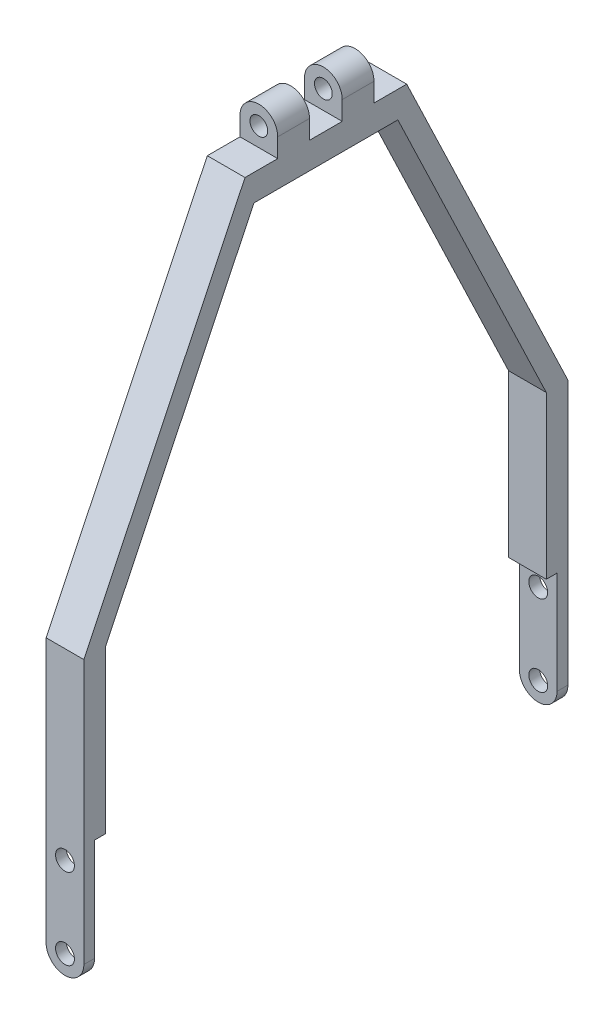
ISO-10303-21;
HEADER;
FILE_DESCRIPTION(('STEP AP214'),'2;1');
FILE_NAME('part.step','',(''),(''),'','','');
FILE_SCHEMA(('AUTOMOTIVE_DESIGN { 1 0 10303 214 1 1 1 1 }'));
ENDSEC;
DATA;
#1=APPLICATION_CONTEXT('core data for automotive mechanical design processes');
#2=APPLICATION_PROTOCOL_DEFINITION('international standard','automotive_design',2000,#1);
#3=PRODUCT_CONTEXT('',#1,'mechanical');
#4=PRODUCT('Part','Part','',(#3));
#5=PRODUCT_RELATED_PRODUCT_CATEGORY('part','',(#4));
#6=PRODUCT_DEFINITION_FORMATION('','',#4);
#7=PRODUCT_DEFINITION_CONTEXT('part definition',#1,'design');
#8=PRODUCT_DEFINITION('design','',#6,#7);
#9=PRODUCT_DEFINITION_SHAPE('','',#8);
#10=(LENGTH_UNIT() NAMED_UNIT(*) SI_UNIT(.MILLI.,.METRE.));
#11=(NAMED_UNIT(*) PLANE_ANGLE_UNIT() SI_UNIT($,.RADIAN.));
#12=(NAMED_UNIT(*) SI_UNIT($,.STERADIAN.) SOLID_ANGLE_UNIT());
#13=UNCERTAINTY_MEASURE_WITH_UNIT(LENGTH_MEASURE(1.E-05),#10,'distance_accuracy_value','');
#14=(GEOMETRIC_REPRESENTATION_CONTEXT(3) GLOBAL_UNCERTAINTY_ASSIGNED_CONTEXT((#13)) GLOBAL_UNIT_ASSIGNED_CONTEXT((#10,
#11,#12)) REPRESENTATION_CONTEXT('',''));
#15=CARTESIAN_POINT('',(0.,0.,0.));
#16=DIRECTION('',(0.,0.,1.));
#17=DIRECTION('',(1.,0.,0.));
#18=AXIS2_PLACEMENT_3D('',#15,#16,#17);
#19=CARTESIAN_POINT('',(0.,100.,-89.8));
#20=DIRECTION('',(0.,0.,1.));
#21=DIRECTION('',(1.,0.,0.));
#22=AXIS2_PLACEMENT_3D('',#19,#20,#21);
#23=CYLINDRICAL_SURFACE('',#22,3.5);
#24=DIRECTION('',(0.,0.,1.));
#25=VECTOR('',#24,1.);
#26=CARTESIAN_POINT('',(3.49999999999999,100.,-89.8));
#27=LINE('',#26,#25);
#28=CARTESIAN_POINT('',(3.49999999999999,100.,-53.83));
#29=VERTEX_POINT('',#28);
#30=CARTESIAN_POINT('',(3.49999999999999,100.,-47.935));
#31=VERTEX_POINT('',#30);
#32=EDGE_CURVE('E12',#29,#31,#27,.T.);
#33=ORIENTED_EDGE('',*,*,#32,.F.);
#34=CARTESIAN_POINT('',(0.,100.,-53.83));
#35=DIRECTION('',(0.,0.,-1.));
#36=DIRECTION('',(-1.,0.,0.));
#37=AXIS2_PLACEMENT_3D('',#34,#35,#36);
#38=CIRCLE('',#37,3.5);
#39=CARTESIAN_POINT('',(-3.50000000000001,100.,-53.83));
#40=VERTEX_POINT('',#39);
#41=EDGE_CURVE('E445',#29,#40,#38,.F.);
#42=ORIENTED_EDGE('',*,*,#41,.T.);
#43=DIRECTION('',(0.,0.,1.));
#44=VECTOR('',#43,1.);
#45=CARTESIAN_POINT('',(-3.50000000000001,100.,-89.8));
#46=LINE('',#45,#44);
#47=CARTESIAN_POINT('',(-3.50000000000001,100.,-47.935));
#48=VERTEX_POINT('',#47);
#49=EDGE_CURVE('E492',#40,#48,#46,.T.);
#50=ORIENTED_EDGE('',*,*,#49,.T.);
#51=CARTESIAN_POINT('',(0.,100.,-47.935));
#52=DIRECTION('',(0.,0.,1.));
#53=DIRECTION('',(1.,0.,0.));
#54=AXIS2_PLACEMENT_3D('',#51,#52,#53);
#55=CIRCLE('',#54,3.5);
#56=EDGE_CURVE('E437',#48,#31,#55,.F.);
#57=ORIENTED_EDGE('',*,*,#56,.T.);
#58=EDGE_LOOP('',(#33,#42,#50,#57));
#59=FACE_BOUND('',#58,.T.);
#60=ADVANCED_FACE('F126',(#59),#23,.T.);
#61=CARTESIAN_POINT('',(0.,100.,-41.865));
#62=DIRECTION('',(0.,0.,1.));
#63=DIRECTION('',(1.,0.,0.));
#64=AXIS2_PLACEMENT_3D('',#61,#62,#63);
#65=CIRCLE('',#64,3.5);
#66=CARTESIAN_POINT('',(-3.50000000000001,100.,-41.865));
#67=VERTEX_POINT('',#66);
#68=CARTESIAN_POINT('',(3.49999999999999,100.,-41.865));
#69=VERTEX_POINT('',#68);
#70=EDGE_CURVE('E296',#67,#69,#65,.F.);
#71=ORIENTED_EDGE('',*,*,#70,.F.);
#72=CARTESIAN_POINT('',(-3.50000000000001,100.,-35.97));
#73=VERTEX_POINT('',#72);
#74=EDGE_CURVE('E480',#67,#73,#46,.T.);
#75=ORIENTED_EDGE('',*,*,#74,.T.);
#76=CARTESIAN_POINT('',(0.,100.,-35.97));
#77=DIRECTION('',(0.,0.,1.));
#78=DIRECTION('',(1.,0.,0.));
#79=AXIS2_PLACEMENT_3D('',#76,#77,#78);
#80=CIRCLE('',#79,3.5);
#81=CARTESIAN_POINT('',(3.49999999999999,100.,-35.97));
#82=VERTEX_POINT('',#81);
#83=EDGE_CURVE('E432',#73,#82,#80,.F.);
#84=ORIENTED_EDGE('',*,*,#83,.T.);
#85=EDGE_CURVE('E140',#69,#82,#27,.T.);
#86=ORIENTED_EDGE('',*,*,#85,.F.);
#87=EDGE_LOOP('',(#71,#75,#84,#86));
#88=FACE_BOUND('',#87,.T.);
#89=ADVANCED_FACE('F535',(#88),#23,.T.);
#90=CARTESIAN_POINT('',(3.49999999999999,-15.,-89.8));
#91=DIRECTION('',(1.,0.,0.));
#92=DIRECTION('',(0.,1.,0.));
#93=AXIS2_PLACEMENT_3D('',#90,#91,#92);
#94=PLANE('',#93);
#95=DIRECTION('',(0.,0.902085364461004,-0.431557638358144));
#96=VECTOR('',#95,1.);
#97=CARTESIAN_POINT('',(3.49999999999999,6.33222783765879,13.236262202464));
#98=LINE('',#97,#96);
#99=CARTESIAN_POINT('',(3.49999999999999,34.,0.));
#100=VERTEX_POINT('',#99);
#101=CARTESIAN_POINT('',(3.49999999999999,96.5,-29.9));
#102=VERTEX_POINT('',#101);
#103=EDGE_CURVE('E403',#100,#102,#98,.T.);
#104=ORIENTED_EDGE('',*,*,#103,.F.);
#105=DIRECTION('',(0.,1.,0.));
#106=VECTOR('',#105,1.);
#107=CARTESIAN_POINT('',(3.49999999999999,-15.,0.));
#108=LINE('',#107,#106);
#109=CARTESIAN_POINT('',(3.49999999999999,-15.,0.));
#110=VERTEX_POINT('',#109);
#111=EDGE_CURVE('E472',#110,#100,#108,.T.);
#112=ORIENTED_EDGE('',*,*,#111,.F.);
#113=DIRECTION('',(0.,0.,1.));
#114=VECTOR('',#113,1.);
#115=CARTESIAN_POINT('',(3.49999999999999,-15.,-89.8));
#116=LINE('',#115,#114);
#117=CARTESIAN_POINT('',(3.49999999999999,-15.,-2.));
#118=VERTEX_POINT('',#117);
#119=EDGE_CURVE('E486',#118,#110,#116,.T.);
#120=ORIENTED_EDGE('',*,*,#119,.F.);
#121=DIRECTION('',(0.,1.,0.));
#122=VECTOR('',#121,1.);
#123=CARTESIAN_POINT('',(3.49999999999999,0.,-2.));
#124=LINE('',#123,#122);
#125=CARTESIAN_POINT('',(3.49999999999999,4.,-2.));
#126=VERTEX_POINT('',#125);
#127=EDGE_CURVE('E359',#118,#126,#124,.T.);
#128=ORIENTED_EDGE('',*,*,#127,.T.);
#129=DIRECTION('',(0.,0.,-1.));
#130=VECTOR('',#129,1.);
#131=CARTESIAN_POINT('',(3.49999999999999,4.,0.));
#132=LINE('',#131,#130);
#133=CARTESIAN_POINT('',(3.49999999999999,4.,-4.));
#134=VERTEX_POINT('',#133);
#135=EDGE_CURVE('E361',#126,#134,#132,.T.);
#136=ORIENTED_EDGE('',*,*,#135,.T.);
#137=DIRECTION('',(0.,1.,0.));
#138=VECTOR('',#137,1.);
#139=CARTESIAN_POINT('',(3.49999999999999,0.,-4.));
#140=LINE('',#139,#138);
#141=CARTESIAN_POINT('',(3.49999999999999,34.,-4.));
#142=VERTEX_POINT('',#141);
#143=EDGE_CURVE('E366',#134,#142,#140,.T.);
#144=ORIENTED_EDGE('',*,*,#143,.T.);
#145=DIRECTION('',(0.,0.902085364461004,-0.431557638358144));
#146=VECTOR('',#145,1.);
#147=CARTESIAN_POINT('',(3.49999999999999,4.77502051972185,9.98123018336507));
#148=LINE('',#147,#146);
#149=CARTESIAN_POINT('',(3.49999999999999,91.5811331500085,-31.5468140989641));
#150=VERTEX_POINT('',#149);
#151=EDGE_CURVE('E341',#142,#150,#148,.T.);
#152=ORIENTED_EDGE('',*,*,#151,.T.);
#153=DIRECTION('',(0.,0.,-1.));
#154=VECTOR('',#153,1.);
#155=CARTESIAN_POINT('',(3.49999999999999,91.5811331500085,0.));
#156=LINE('',#155,#154);
#157=CARTESIAN_POINT('',(3.49999999999999,91.5811331500085,-58.2531859010359));
#158=VERTEX_POINT('',#157);
#159=EDGE_CURVE('E350',#150,#158,#156,.T.);
#160=ORIENTED_EDGE('',*,*,#159,.T.);
#161=DIRECTION('',(0.,0.902085364461004,0.431557638358144));
#162=VECTOR('',#161,1.);
#163=CARTESIAN_POINT('',(3.49999999999999,39.7343248074063,-83.0566990121368));
#164=LINE('',#163,#162);
#165=CARTESIAN_POINT('',(3.49999999999999,34.,-85.8));
#166=VERTEX_POINT('',#165);
#167=EDGE_CURVE('E353',#166,#158,#164,.T.);
#168=ORIENTED_EDGE('',*,*,#167,.F.);
#169=DIRECTION('',(0.,1.,0.));
#170=VECTOR('',#169,1.);
#171=CARTESIAN_POINT('',(3.49999999999999,0.,-85.8));
#172=LINE('',#171,#170);
#173=CARTESIAN_POINT('',(3.49999999999999,4.,-85.8));
#174=VERTEX_POINT('',#173);
#175=EDGE_CURVE('E354',#174,#166,#172,.T.);
#176=ORIENTED_EDGE('',*,*,#175,.F.);
#177=CARTESIAN_POINT('',(3.49999999999999,4.,-87.8));
#178=VERTEX_POINT('',#177);
#179=EDGE_CURVE('E357',#174,#178,#132,.T.);
#180=ORIENTED_EDGE('',*,*,#179,.T.);
#181=DIRECTION('',(0.,1.,0.));
#182=VECTOR('',#181,1.);
#183=CARTESIAN_POINT('',(3.49999999999999,0.,-87.8));
#184=LINE('',#183,#182);
#185=CARTESIAN_POINT('',(3.49999999999999,-15.,-87.8));
#186=VERTEX_POINT('',#185);
#187=EDGE_CURVE('E356',#186,#178,#184,.T.);
#188=ORIENTED_EDGE('',*,*,#187,.F.);
#189=CARTESIAN_POINT('',(3.49999999999999,-15.,-89.8));
#190=VERTEX_POINT('',#189);
#191=EDGE_CURVE('E482',#190,#186,#116,.T.);
#192=ORIENTED_EDGE('',*,*,#191,.F.);
#193=DIRECTION('',(0.,1.,0.));
#194=VECTOR('',#193,1.);
#195=CARTESIAN_POINT('',(3.49999999999999,-15.,-89.8));
#196=LINE('',#195,#194);
#197=CARTESIAN_POINT('',(3.49999999999999,34.,-89.8));
#198=VERTEX_POINT('',#197);
#199=EDGE_CURVE('E471',#190,#198,#196,.T.);
#200=ORIENTED_EDGE('',*,*,#199,.T.);
#201=DIRECTION('',(0.,-0.902085364461004,-0.431557638358144));
#202=VECTOR('',#201,1.);
#203=CARTESIAN_POINT('',(3.49999999999999,41.2915321253432,-86.3117310312358));
#204=LINE('',#203,#202);
#205=CARTESIAN_POINT('',(3.49999999999999,96.5,-59.9));
#206=VERTEX_POINT('',#205);
#207=EDGE_CURVE('E399',#206,#198,#204,.T.);
#208=ORIENTED_EDGE('',*,*,#207,.F.);
#209=DIRECTION('',(0.,0.,1.));
#210=VECTOR('',#209,1.);
#211=CARTESIAN_POINT('',(3.49999999999999,96.5000000000002,-2.20627104358171E-13));
#212=LINE('',#211,#210);
#213=CARTESIAN_POINT('',(3.49999999999999,96.5,-53.83));
#214=VERTEX_POINT('',#213);
#215=EDGE_CURVE('E405',#206,#214,#212,.T.);
#216=ORIENTED_EDGE('',*,*,#215,.T.);
#217=DIRECTION('',(0.,1.,0.));
#218=VECTOR('',#217,1.);
#219=CARTESIAN_POINT('',(3.49999999999999,0.,-53.83));
#220=LINE('',#219,#218);
#221=EDGE_CURVE('E398',#214,#29,#220,.T.);
#222=ORIENTED_EDGE('',*,*,#221,.T.);
#223=ORIENTED_EDGE('',*,*,#32,.T.);
#224=DIRECTION('',(0.,-1.,0.));
#225=VECTOR('',#224,1.);
#226=CARTESIAN_POINT('',(3.49999999999999,103.5,-47.935));
#227=LINE('',#226,#225);
#228=CARTESIAN_POINT('',(3.49999999999999,96.5,-47.935));
#229=VERTEX_POINT('',#228);
#230=EDGE_CURVE('E319',#31,#229,#227,.T.);
#231=ORIENTED_EDGE('',*,*,#230,.T.);
#232=DIRECTION('',(0.,0.,1.));
#233=VECTOR('',#232,1.);
#234=CARTESIAN_POINT('',(3.49999999999999,96.5,-47.935));
#235=LINE('',#234,#233);
#236=CARTESIAN_POINT('',(3.49999999999999,96.5,-41.865));
#237=VERTEX_POINT('',#236);
#238=EDGE_CURVE('E303',#229,#237,#235,.T.);
#239=ORIENTED_EDGE('',*,*,#238,.T.);
#240=DIRECTION('',(0.,-1.,0.));
#241=VECTOR('',#240,1.);
#242=CARTESIAN_POINT('',(3.49999999999999,103.5,-41.865));
#243=LINE('',#242,#241);
#244=EDGE_CURVE('E293',#69,#237,#243,.T.);
#245=ORIENTED_EDGE('',*,*,#244,.F.);
#246=ORIENTED_EDGE('',*,*,#85,.T.);
#247=DIRECTION('',(0.,-1.,0.));
#248=VECTOR('',#247,1.);
#249=CARTESIAN_POINT('',(3.49999999999999,0.,-35.97));
#250=LINE('',#249,#248);
#251=CARTESIAN_POINT('',(3.49999999999999,96.5,-35.97));
#252=VERTEX_POINT('',#251);
#253=EDGE_CURVE('E414',#82,#252,#250,.T.);
#254=ORIENTED_EDGE('',*,*,#253,.T.);
#255=DIRECTION('',(0.,0.,-1.));
#256=VECTOR('',#255,1.);
#257=CARTESIAN_POINT('',(3.49999999999999,96.4999999999999,2.2062710435817E-13));
#258=LINE('',#257,#256);
#259=EDGE_CURVE('E421',#102,#252,#258,.T.);
#260=ORIENTED_EDGE('',*,*,#259,.F.);
#261=EDGE_LOOP('',(#104,#112,#120,#128,#136,#144,#152,#160,#168,#176,#180,#188,#192,#200,#208,
#216,#222,#223,#231,#239,#245,#246,#254,#260));
#262=FACE_BOUND('',#261,.T.);
#263=ADVANCED_FACE('F317',(#262),#94,.T.);
#264=CARTESIAN_POINT('',(0.,-15.,-89.8));
#265=DIRECTION('',(0.,0.,1.));
#266=DIRECTION('',(1.,0.,0.));
#267=AXIS2_PLACEMENT_3D('',#264,#265,#266);
#268=CYLINDRICAL_SURFACE('',#267,3.49999999999999);
#269=DIRECTION('',(0.,0.,1.));
#270=VECTOR('',#269,1.);
#271=CARTESIAN_POINT('',(-3.49999999999999,-15.,-89.8));
#272=LINE('',#271,#270);
#273=CARTESIAN_POINT('',(-3.50000000000001,-15.,-2.));
#274=VERTEX_POINT('',#273);
#275=CARTESIAN_POINT('',(-3.49999999999999,-15.,0.));
#276=VERTEX_POINT('',#275);
#277=EDGE_CURVE('E495',#274,#276,#272,.T.);
#278=ORIENTED_EDGE('',*,*,#277,.F.);
#279=CARTESIAN_POINT('',(0.,-15.,-2.));
#280=DIRECTION('',(0.,0.,-1.));
#281=DIRECTION('',(-1.,0.,0.));
#282=AXIS2_PLACEMENT_3D('',#279,#280,#281);
#283=CIRCLE('',#282,3.49999999999999);
#284=EDGE_CURVE('E449',#274,#118,#283,.F.);
#285=ORIENTED_EDGE('',*,*,#284,.T.);
#286=ORIENTED_EDGE('',*,*,#119,.T.);
#287=CARTESIAN_POINT('',(0.,-15.,0.));
#288=DIRECTION('',(0.,0.,1.));
#289=DIRECTION('',(1.,0.,0.));
#290=AXIS2_PLACEMENT_3D('',#287,#288,#289);
#291=CIRCLE('',#290,3.49999999999999);
#292=EDGE_CURVE('E477',#276,#110,#291,.T.);
#293=ORIENTED_EDGE('',*,*,#292,.F.);
#294=EDGE_LOOP('',(#278,#285,#286,#293));
#295=FACE_BOUND('',#294,.T.);
#296=ADVANCED_FACE('F521',(#295),#268,.T.);
#297=CARTESIAN_POINT('',(0.,0.,-89.8));
#298=DIRECTION('',(0.,0.,1.));
#299=DIRECTION('',(1.,0.,0.));
#300=AXIS2_PLACEMENT_3D('',#297,#298,#299);
#301=CYLINDRICAL_SURFACE('',#300,1.75);
#302=CARTESIAN_POINT('',(0.,0.,0.));
#303=DIRECTION('',(0.,0.,1.));
#304=DIRECTION('',(1.,0.,0.));
#305=AXIS2_PLACEMENT_3D('',#302,#303,#304);
#306=CIRCLE('',#305,1.75);
#307=CARTESIAN_POINT('',(1.75,0.,0.));
#308=VERTEX_POINT('',#307);
#309=EDGE_CURVE('E459',#308,#308,#306,.T.);
#310=ORIENTED_EDGE('',*,*,#309,.T.);
#311=EDGE_LOOP('',(#310));
#312=FACE_BOUND('',#311,.T.);
#313=CARTESIAN_POINT('',(0.,0.,-2.));
#314=DIRECTION('',(0.,0.,-1.));
#315=DIRECTION('',(-1.,0.,0.));
#316=AXIS2_PLACEMENT_3D('',#313,#314,#315);
#317=CIRCLE('',#316,1.75);
#318=CARTESIAN_POINT('',(-1.75,0.,-2.));
#319=VERTEX_POINT('',#318);
#320=EDGE_CURVE('E444',#319,#319,#317,.F.);
#321=ORIENTED_EDGE('',*,*,#320,.F.);
#322=EDGE_LOOP('',(#321));
#323=FACE_BOUND('',#322,.T.);
#324=ADVANCED_FACE('F515',(#312,#323),#301,.F.);
#325=CARTESIAN_POINT('',(0.,-15.,-89.8));
#326=DIRECTION('',(0.,0.,1.));
#327=DIRECTION('',(1.,0.,0.));
#328=AXIS2_PLACEMENT_3D('',#325,#326,#327);
#329=CYLINDRICAL_SURFACE('',#328,1.75);
#330=CARTESIAN_POINT('',(0.,-15.,0.));
#331=DIRECTION('',(0.,0.,1.));
#332=DIRECTION('',(1.,0.,0.));
#333=AXIS2_PLACEMENT_3D('',#330,#331,#332);
#334=CIRCLE('',#333,1.75);
#335=CARTESIAN_POINT('',(1.75,-15.,0.));
#336=VERTEX_POINT('',#335);
#337=EDGE_CURVE('E453',#336,#336,#334,.T.);
#338=ORIENTED_EDGE('',*,*,#337,.T.);
#339=EDGE_LOOP('',(#338));
#340=FACE_BOUND('',#339,.T.);
#341=CARTESIAN_POINT('',(0.,-15.,-2.));
#342=DIRECTION('',(0.,0.,-1.));
#343=DIRECTION('',(-1.,0.,0.));
#344=AXIS2_PLACEMENT_3D('',#341,#342,#343);
#345=CIRCLE('',#344,1.75);
#346=CARTESIAN_POINT('',(-1.75,-15.,-2.));
#347=VERTEX_POINT('',#346);
#348=EDGE_CURVE('E443',#347,#347,#345,.F.);
#349=ORIENTED_EDGE('',*,*,#348,.F.);
#350=EDGE_LOOP('',(#349));
#351=FACE_BOUND('',#350,.T.);
#352=ADVANCED_FACE('F508',(#340,#351),#329,.F.);
#353=CARTESIAN_POINT('',(0.,-15.,-87.8));
#354=DIRECTION('',(0.,0.,-1.));
#355=DIRECTION('',(-1.,0.,0.));
#356=AXIS2_PLACEMENT_3D('',#353,#354,#355);
#357=CIRCLE('',#356,3.49999999999999);
#358=CARTESIAN_POINT('',(-3.50000000000001,-15.,-87.8));
#359=VERTEX_POINT('',#358);
#360=EDGE_CURVE('E454',#359,#186,#357,.F.);
#361=ORIENTED_EDGE('',*,*,#360,.F.);
#362=CARTESIAN_POINT('',(-3.49999999999999,-15.,-89.8));
#363=VERTEX_POINT('',#362);
#364=EDGE_CURVE('E490',#363,#359,#272,.T.);
#365=ORIENTED_EDGE('',*,*,#364,.F.);
#366=CARTESIAN_POINT('',(0.,-15.,-89.8));
#367=DIRECTION('',(0.,0.,1.));
#368=DIRECTION('',(1.,0.,0.));
#369=AXIS2_PLACEMENT_3D('',#366,#367,#368);
#370=CIRCLE('',#369,3.49999999999999);
#371=EDGE_CURVE('E468',#363,#190,#370,.T.);
#372=ORIENTED_EDGE('',*,*,#371,.T.);
#373=ORIENTED_EDGE('',*,*,#191,.T.);
#374=EDGE_LOOP('',(#361,#365,#372,#373));
#375=FACE_BOUND('',#374,.T.);
#376=ADVANCED_FACE('F512',(#375),#268,.T.);
#377=CARTESIAN_POINT('',(-3.50000000000001,100.,-89.8));
#378=DIRECTION('',(-1.,0.,0.));
#379=DIRECTION('',(0.,-1.,0.));
#380=AXIS2_PLACEMENT_3D('',#377,#378,#379);
#381=PLANE('',#380);
#382=DIRECTION('',(0.,1.,0.));
#383=VECTOR('',#382,1.);
#384=CARTESIAN_POINT('',(-3.50000000000001,0.,-2.));
#385=LINE('',#384,#383);
#386=CARTESIAN_POINT('',(-3.5,4.00000000000001,-2.));
#387=VERTEX_POINT('',#386);
#388=EDGE_CURVE('E384',#274,#387,#385,.T.);
#389=ORIENTED_EDGE('',*,*,#388,.F.);
#390=ORIENTED_EDGE('',*,*,#277,.T.);
#391=DIRECTION('',(0.,-1.,0.));
#392=VECTOR('',#391,1.);
#393=CARTESIAN_POINT('',(-3.50000000000001,100.,0.));
#394=LINE('',#393,#392);
#395=CARTESIAN_POINT('',(-3.50000000000001,34.,0.));
#396=VERTEX_POINT('',#395);
#397=EDGE_CURVE('E462',#396,#276,#394,.T.);
#398=ORIENTED_EDGE('',*,*,#397,.F.);
#399=DIRECTION('',(0.,0.902085364461004,-0.431557638358144));
#400=VECTOR('',#399,1.);
#401=CARTESIAN_POINT('',(-3.50000000000001,6.33222783765879,13.236262202464));
#402=LINE('',#401,#400);
#403=CARTESIAN_POINT('',(-3.50000000000001,96.5,-29.9));
#404=VERTEX_POINT('',#403);
#405=EDGE_CURVE('E408',#396,#404,#402,.T.);
#406=ORIENTED_EDGE('',*,*,#405,.T.);
#407=DIRECTION('',(0.,0.,-1.));
#408=VECTOR('',#407,1.);
#409=CARTESIAN_POINT('',(-3.50000000000001,96.4999999999999,2.2062710435817E-13));
#410=LINE('',#409,#408);
#411=CARTESIAN_POINT('',(-3.50000000000001,96.5,-35.97));
#412=VERTEX_POINT('',#411);
#413=EDGE_CURVE('E411',#404,#412,#410,.T.);
#414=ORIENTED_EDGE('',*,*,#413,.T.);
#415=DIRECTION('',(0.,-1.,0.));
#416=VECTOR('',#415,1.);
#417=CARTESIAN_POINT('',(-3.50000000000001,0.,-35.97));
#418=LINE('',#417,#416);
#419=EDGE_CURVE('E420',#73,#412,#418,.T.);
#420=ORIENTED_EDGE('',*,*,#419,.F.);
#421=ORIENTED_EDGE('',*,*,#74,.F.);
#422=DIRECTION('',(0.,-1.,0.));
#423=VECTOR('',#422,1.);
#424=CARTESIAN_POINT('',(-3.50000000000001,103.5,-41.865));
#425=LINE('',#424,#423);
#426=CARTESIAN_POINT('',(-3.50000000000001,96.5,-41.865));
#427=VERTEX_POINT('',#426);
#428=EDGE_CURVE('E311',#67,#427,#425,.T.);
#429=ORIENTED_EDGE('',*,*,#428,.T.);
#430=DIRECTION('',(0.,0.,1.));
#431=VECTOR('',#430,1.);
#432=CARTESIAN_POINT('',(-3.50000000000001,96.5,-47.935));
#433=LINE('',#432,#431);
#434=CARTESIAN_POINT('',(-3.50000000000001,96.5,-47.935));
#435=VERTEX_POINT('',#434);
#436=EDGE_CURVE('E309',#435,#427,#433,.T.);
#437=ORIENTED_EDGE('',*,*,#436,.F.);
#438=DIRECTION('',(0.,-1.,0.));
#439=VECTOR('',#438,1.);
#440=CARTESIAN_POINT('',(-3.50000000000001,103.5,-47.935));
#441=LINE('',#440,#439);
#442=EDGE_CURVE('E302',#48,#435,#441,.T.);
#443=ORIENTED_EDGE('',*,*,#442,.F.);
#444=ORIENTED_EDGE('',*,*,#49,.F.);
#445=DIRECTION('',(0.,1.,0.));
#446=VECTOR('',#445,1.);
#447=CARTESIAN_POINT('',(-3.50000000000001,0.,-53.83));
#448=LINE('',#447,#446);
#449=CARTESIAN_POINT('',(-3.50000000000001,96.5,-53.83));
#450=VERTEX_POINT('',#449);
#451=EDGE_CURVE('E388',#450,#40,#448,.T.);
#452=ORIENTED_EDGE('',*,*,#451,.F.);
#453=DIRECTION('',(0.,0.,1.));
#454=VECTOR('',#453,1.);
#455=CARTESIAN_POINT('',(-3.50000000000001,96.5000000000002,-2.20627104358171E-13));
#456=LINE('',#455,#454);
#457=CARTESIAN_POINT('',(-3.50000000000001,96.5,-59.9));
#458=VERTEX_POINT('',#457);
#459=EDGE_CURVE('E397',#458,#450,#456,.T.);
#460=ORIENTED_EDGE('',*,*,#459,.F.);
#461=DIRECTION('',(0.,-0.902085364461004,-0.431557638358144));
#462=VECTOR('',#461,1.);
#463=CARTESIAN_POINT('',(-3.50000000000001,41.2915321253432,-86.3117310312358));
#464=LINE('',#463,#462);
#465=CARTESIAN_POINT('',(-3.50000000000001,34.,-89.8));
#466=VERTEX_POINT('',#465);
#467=EDGE_CURVE('E151',#458,#466,#464,.T.);
#468=ORIENTED_EDGE('',*,*,#467,.T.);
#469=DIRECTION('',(0.,-1.,0.));
#470=VECTOR('',#469,1.);
#471=CARTESIAN_POINT('',(-3.50000000000001,100.,-89.8));
#472=LINE('',#471,#470);
#473=EDGE_CURVE('E466',#466,#363,#472,.T.);
#474=ORIENTED_EDGE('',*,*,#473,.T.);
#475=ORIENTED_EDGE('',*,*,#364,.T.);
#476=DIRECTION('',(0.,1.,0.));
#477=VECTOR('',#476,1.);
#478=CARTESIAN_POINT('',(-3.50000000000001,0.,-87.8));
#479=LINE('',#478,#477);
#480=CARTESIAN_POINT('',(-3.50000000000001,4.,-87.8));
#481=VERTEX_POINT('',#480);
#482=EDGE_CURVE('E379',#359,#481,#479,.T.);
#483=ORIENTED_EDGE('',*,*,#482,.T.);
#484=DIRECTION('',(0.,0.,-1.));
#485=VECTOR('',#484,1.);
#486=CARTESIAN_POINT('',(-3.50000000000001,4.,0.));
#487=LINE('',#486,#485);
#488=CARTESIAN_POINT('',(-3.50000000000001,4.,-85.8));
#489=VERTEX_POINT('',#488);
#490=EDGE_CURVE('E378',#489,#481,#487,.T.);
#491=ORIENTED_EDGE('',*,*,#490,.F.);
#492=DIRECTION('',(0.,1.,0.));
#493=VECTOR('',#492,1.);
#494=CARTESIAN_POINT('',(-3.50000000000001,0.,-85.8));
#495=LINE('',#494,#493);
#496=CARTESIAN_POINT('',(-3.50000000000001,34.,-85.8));
#497=VERTEX_POINT('',#496);
#498=EDGE_CURVE('E376',#489,#497,#495,.T.);
#499=ORIENTED_EDGE('',*,*,#498,.T.);
#500=DIRECTION('',(0.,0.902085364461004,0.431557638358144));
#501=VECTOR('',#500,1.);
#502=CARTESIAN_POINT('',(-3.50000000000001,39.7343248074063,-83.0566990121368));
#503=LINE('',#502,#501);
#504=CARTESIAN_POINT('',(-3.50000000000001,91.5811331500085,-58.2531859010359));
#505=VERTEX_POINT('',#504);
#506=EDGE_CURVE('E373',#497,#505,#503,.T.);
#507=ORIENTED_EDGE('',*,*,#506,.T.);
#508=DIRECTION('',(0.,0.,-1.));
#509=VECTOR('',#508,1.);
#510=CARTESIAN_POINT('',(-3.50000000000001,91.5811331500085,0.));
#511=LINE('',#510,#509);
#512=CARTESIAN_POINT('',(-3.50000000000001,91.5811331500085,-31.5468140989641));
#513=VERTEX_POINT('',#512);
#514=EDGE_CURVE('E371',#513,#505,#511,.T.);
#515=ORIENTED_EDGE('',*,*,#514,.F.);
#516=DIRECTION('',(0.,0.902085364461004,-0.431557638358144));
#517=VECTOR('',#516,1.);
#518=CARTESIAN_POINT('',(-3.50000000000001,4.77502051972185,9.98123018336507));
#519=LINE('',#518,#517);
#520=CARTESIAN_POINT('',(-3.50000000000001,34.,-4.));
#521=VERTEX_POINT('',#520);
#522=EDGE_CURVE('E329',#521,#513,#519,.T.);
#523=ORIENTED_EDGE('',*,*,#522,.F.);
#524=DIRECTION('',(0.,1.,0.));
#525=VECTOR('',#524,1.);
#526=CARTESIAN_POINT('',(-3.50000000000001,0.,-4.));
#527=LINE('',#526,#525);
#528=CARTESIAN_POINT('',(-3.50000000000001,4.,-4.));
#529=VERTEX_POINT('',#528);
#530=EDGE_CURVE('E346',#529,#521,#527,.T.);
#531=ORIENTED_EDGE('',*,*,#530,.F.);
#532=EDGE_CURVE('E383',#387,#529,#487,.T.);
#533=ORIENTED_EDGE('',*,*,#532,.F.);
#534=EDGE_LOOP('',(#389,#390,#398,#406,#414,#420,#421,#429,#437,#443,#444,#452,#460,#468,#474,
#475,#483,#491,#499,#507,#515,#523,#531,#533));
#535=FACE_BOUND('',#534,.T.);
#536=ADVANCED_FACE('F518',(#535),#381,.T.);
#537=CARTESIAN_POINT('',(0.,100.,-89.8));
#538=DIRECTION('',(0.,0.,1.));
#539=DIRECTION('',(1.,0.,0.));
#540=AXIS2_PLACEMENT_3D('',#537,#538,#539);
#541=PLANE('',#540);
#542=CARTESIAN_POINT('',(0.,-15.,-89.8));
#543=DIRECTION('',(0.,0.,1.));
#544=DIRECTION('',(1.,0.,0.));
#545=AXIS2_PLACEMENT_3D('',#542,#543,#544);
#546=CIRCLE('',#545,1.75);
#547=CARTESIAN_POINT('',(1.75,-15.,-89.8));
#548=VERTEX_POINT('',#547);
#549=EDGE_CURVE('E458',#548,#548,#546,.T.);
#550=ORIENTED_EDGE('',*,*,#549,.T.);
#551=EDGE_LOOP('',(#550));
#552=FACE_BOUND('',#551,.T.);
#553=CARTESIAN_POINT('',(0.,0.,-89.8));
#554=DIRECTION('',(0.,0.,1.));
#555=DIRECTION('',(1.,0.,0.));
#556=AXIS2_PLACEMENT_3D('',#553,#554,#555);
#557=CIRCLE('',#556,1.75);
#558=CARTESIAN_POINT('',(1.75,0.,-89.8));
#559=VERTEX_POINT('',#558);
#560=EDGE_CURVE('E465',#559,#559,#557,.T.);
#561=ORIENTED_EDGE('',*,*,#560,.T.);
#562=EDGE_LOOP('',(#561));
#563=FACE_BOUND('',#562,.T.);
#564=ORIENTED_EDGE('',*,*,#473,.F.);
#565=DIRECTION('',(1.,0.,0.));
#566=VECTOR('',#565,1.);
#567=CARTESIAN_POINT('',(-3.50000000000001,34.,-89.8));
#568=LINE('',#567,#566);
#569=EDGE_CURVE('E393',#466,#198,#568,.T.);
#570=ORIENTED_EDGE('',*,*,#569,.T.);
#571=ORIENTED_EDGE('',*,*,#199,.F.);
#572=ORIENTED_EDGE('',*,*,#371,.F.);
#573=EDGE_LOOP('',(#564,#570,#571,#572));
#574=FACE_BOUND('',#573,.T.);
#575=ADVANCED_FACE('F821',(#552,#563,#574),#541,.F.);
#576=CARTESIAN_POINT('',(0.,100.,0.));
#577=DIRECTION('',(0.,0.,1.));
#578=DIRECTION('',(1.,0.,0.));
#579=AXIS2_PLACEMENT_3D('',#576,#577,#578);
#580=PLANE('',#579);
#581=DIRECTION('',(1.,0.,0.));
#582=VECTOR('',#581,1.);
#583=CARTESIAN_POINT('',(-3.50000000000001,34.,0.));
#584=LINE('',#583,#582);
#585=EDGE_CURVE('E417',#396,#100,#584,.T.);
#586=ORIENTED_EDGE('',*,*,#585,.F.);
#587=ORIENTED_EDGE('',*,*,#397,.T.);
#588=ORIENTED_EDGE('',*,*,#292,.T.);
#589=ORIENTED_EDGE('',*,*,#111,.T.);
#590=EDGE_LOOP('',(#586,#587,#588,#589));
#591=FACE_BOUND('',#590,.T.);
#592=ORIENTED_EDGE('',*,*,#337,.F.);
#593=EDGE_LOOP('',(#592));
#594=FACE_BOUND('',#593,.T.);
#595=ORIENTED_EDGE('',*,*,#309,.F.);
#596=EDGE_LOOP('',(#595));
#597=FACE_BOUND('',#596,.T.);
#598=ADVANCED_FACE('F565',(#591,#594,#597),#580,.T.);
#599=CARTESIAN_POINT('',(0.,0.,-87.8));
#600=DIRECTION('',(0.,0.,-1.));
#601=DIRECTION('',(-1.,0.,0.));
#602=AXIS2_PLACEMENT_3D('',#599,#600,#601);
#603=CIRCLE('',#602,1.75);
#604=CARTESIAN_POINT('',(-1.75,0.,-87.8));
#605=VERTEX_POINT('',#604);
#606=EDGE_CURVE('E448',#605,#605,#603,.F.);
#607=ORIENTED_EDGE('',*,*,#606,.T.);
#608=EDGE_LOOP('',(#607));
#609=FACE_BOUND('',#608,.T.);
#610=ORIENTED_EDGE('',*,*,#560,.F.);
#611=EDGE_LOOP('',(#610));
#612=FACE_BOUND('',#611,.T.);
#613=ADVANCED_FACE('F528',(#609,#612),#301,.F.);
#614=CARTESIAN_POINT('',(0.,-15.,-87.8));
#615=DIRECTION('',(0.,0.,-1.));
#616=DIRECTION('',(-1.,0.,0.));
#617=AXIS2_PLACEMENT_3D('',#614,#615,#616);
#618=CIRCLE('',#617,1.75);
#619=CARTESIAN_POINT('',(-1.75,-15.,-87.8));
#620=VERTEX_POINT('',#619);
#621=EDGE_CURVE('E135',#620,#620,#618,.F.);
#622=ORIENTED_EDGE('',*,*,#621,.T.);
#623=EDGE_LOOP('',(#622));
#624=FACE_BOUND('',#623,.T.);
#625=ORIENTED_EDGE('',*,*,#549,.F.);
#626=EDGE_LOOP('',(#625));
#627=FACE_BOUND('',#626,.T.);
#628=ADVANCED_FACE('F513',(#624,#627),#329,.F.);
#629=CARTESIAN_POINT('',(-3.50000000000001,0.,-35.97));
#630=DIRECTION('',(0.,0.,1.));
#631=DIRECTION('',(1.,0.,0.));
#632=AXIS2_PLACEMENT_3D('',#629,#630,#631);
#633=PLANE('',#632);
#634=ORIENTED_EDGE('',*,*,#419,.T.);
#635=DIRECTION('',(1.,0.,0.));
#636=VECTOR('',#635,1.);
#637=CARTESIAN_POINT('',(-3.50000000000001,96.5,-35.97));
#638=LINE('',#637,#636);
#639=EDGE_CURVE('E426',#412,#252,#638,.T.);
#640=ORIENTED_EDGE('',*,*,#639,.T.);
#641=ORIENTED_EDGE('',*,*,#253,.F.);
#642=ORIENTED_EDGE('',*,*,#83,.F.);
#643=EDGE_LOOP('',(#634,#640,#641,#642));
#644=FACE_BOUND('',#643,.T.);
#645=CARTESIAN_POINT('',(0.,100.,-35.97));
#646=DIRECTION('',(0.,0.,1.));
#647=DIRECTION('',(1.,0.,0.));
#648=AXIS2_PLACEMENT_3D('',#645,#646,#647);
#649=CIRCLE('',#648,1.65);
#650=CARTESIAN_POINT('',(1.64999999999999,100.,-35.97));
#651=VERTEX_POINT('',#650);
#652=EDGE_CURVE('E427',#651,#651,#649,.F.);
#653=ORIENTED_EDGE('',*,*,#652,.T.);
#654=EDGE_LOOP('',(#653));
#655=FACE_BOUND('',#654,.T.);
#656=ADVANCED_FACE('F529',(#644,#655),#633,.T.);
#657=CARTESIAN_POINT('',(-3.50000000000001,96.4999999999999,2.2062710435817E-13));
#658=DIRECTION('',(0.,-1.,0.));
#659=DIRECTION('',(0.,0.,-1.));
#660=AXIS2_PLACEMENT_3D('',#657,#658,#659);
#661=PLANE('',#660);
#662=ORIENTED_EDGE('',*,*,#259,.T.);
#663=ORIENTED_EDGE('',*,*,#639,.F.);
#664=ORIENTED_EDGE('',*,*,#413,.F.);
#665=DIRECTION('',(1.,0.,0.));
#666=VECTOR('',#665,1.);
#667=CARTESIAN_POINT('',(-3.50000000000001,96.5,-29.9));
#668=LINE('',#667,#666);
#669=EDGE_CURVE('E431',#404,#102,#668,.T.);
#670=ORIENTED_EDGE('',*,*,#669,.T.);
#671=EDGE_LOOP('',(#662,#663,#664,#670));
#672=FACE_BOUND('',#671,.T.);
#673=ADVANCED_FACE('F573',(#672),#661,.F.);
#674=CARTESIAN_POINT('',(-3.50000000000001,6.33222783765879,13.236262202464));
#675=DIRECTION('',(0.,-0.431557638358144,-0.902085364461003));
#676=DIRECTION('',(0.,0.902085364461004,-0.431557638358144));
#677=AXIS2_PLACEMENT_3D('',#674,#675,#676);
#678=PLANE('',#677);
#679=ORIENTED_EDGE('',*,*,#103,.T.);
#680=ORIENTED_EDGE('',*,*,#669,.F.);
#681=ORIENTED_EDGE('',*,*,#405,.F.);
#682=ORIENTED_EDGE('',*,*,#585,.T.);
#683=EDGE_LOOP('',(#679,#680,#681,#682));
#684=FACE_BOUND('',#683,.T.);
#685=ADVANCED_FACE('F567',(#684),#678,.F.);
#686=CARTESIAN_POINT('',(-3.50000000000001,103.5,-47.935));
#687=DIRECTION('',(0.,0.,1.));
#688=DIRECTION('',(1.,0.,0.));
#689=AXIS2_PLACEMENT_3D('',#686,#687,#688);
#690=PLANE('',#689);
#691=ORIENTED_EDGE('',*,*,#442,.T.);
#692=DIRECTION('',(1.,0.,0.));
#693=VECTOR('',#692,1.);
#694=CARTESIAN_POINT('',(-3.50000000000001,96.5,-47.935));
#695=LINE('',#694,#693);
#696=EDGE_CURVE('E315',#435,#229,#695,.T.);
#697=ORIENTED_EDGE('',*,*,#696,.T.);
#698=ORIENTED_EDGE('',*,*,#230,.F.);
#699=ORIENTED_EDGE('',*,*,#56,.F.);
#700=EDGE_LOOP('',(#691,#697,#698,#699));
#701=FACE_BOUND('',#700,.T.);
#702=CARTESIAN_POINT('',(0.,100.,-47.935));
#703=DIRECTION('',(0.,0.,1.));
#704=DIRECTION('',(1.,0.,0.));
#705=AXIS2_PLACEMENT_3D('',#702,#703,#704);
#706=CIRCLE('',#705,1.65);
#707=CARTESIAN_POINT('',(1.64999999999999,100.,-47.935));
#708=VERTEX_POINT('',#707);
#709=EDGE_CURVE('E438',#708,#708,#706,.F.);
#710=ORIENTED_EDGE('',*,*,#709,.T.);
#711=EDGE_LOOP('',(#710));
#712=FACE_BOUND('',#711,.T.);
#713=ADVANCED_FACE('F603',(#701,#712),#690,.T.);
#714=CARTESIAN_POINT('',(-3.50000000000001,103.5,-41.865));
#715=DIRECTION('',(0.,0.,1.));
#716=DIRECTION('',(1.,0.,0.));
#717=AXIS2_PLACEMENT_3D('',#714,#715,#716);
#718=PLANE('',#717);
#719=ORIENTED_EDGE('',*,*,#70,.T.);
#720=ORIENTED_EDGE('',*,*,#244,.T.);
#721=DIRECTION('',(1.,0.,0.));
#722=VECTOR('',#721,1.);
#723=CARTESIAN_POINT('',(-3.50000000000001,96.5,-41.865));
#724=LINE('',#723,#722);
#725=EDGE_CURVE('E294',#427,#237,#724,.T.);
#726=ORIENTED_EDGE('',*,*,#725,.F.);
#727=ORIENTED_EDGE('',*,*,#428,.F.);
#728=EDGE_LOOP('',(#719,#720,#726,#727));
#729=FACE_BOUND('',#728,.T.);
#730=CARTESIAN_POINT('',(0.,100.,-41.865));
#731=DIRECTION('',(0.,0.,1.));
#732=DIRECTION('',(1.,0.,0.));
#733=AXIS2_PLACEMENT_3D('',#730,#731,#732);
#734=CIRCLE('',#733,1.65);
#735=CARTESIAN_POINT('',(1.64999999999999,100.,-41.865));
#736=VERTEX_POINT('',#735);
#737=EDGE_CURVE('E436',#736,#736,#734,.F.);
#738=ORIENTED_EDGE('',*,*,#737,.F.);
#739=EDGE_LOOP('',(#738));
#740=FACE_BOUND('',#739,.T.);
#741=ADVANCED_FACE('F291',(#729,#740),#718,.F.);
#742=CARTESIAN_POINT('',(-3.50000000000001,96.5,-47.935));
#743=DIRECTION('',(0.,1.,0.));
#744=DIRECTION('',(0.,0.,1.));
#745=AXIS2_PLACEMENT_3D('',#742,#743,#744);
#746=PLANE('',#745);
#747=ORIENTED_EDGE('',*,*,#238,.F.);
#748=ORIENTED_EDGE('',*,*,#696,.F.);
#749=ORIENTED_EDGE('',*,*,#436,.T.);
#750=ORIENTED_EDGE('',*,*,#725,.T.);
#751=EDGE_LOOP('',(#747,#748,#749,#750));
#752=FACE_BOUND('',#751,.T.);
#753=ADVANCED_FACE('F310',(#752),#746,.T.);
#754=CARTESIAN_POINT('',(0.,100.,-89.8));
#755=DIRECTION('',(0.,0.,1.));
#756=DIRECTION('',(1.,0.,0.));
#757=AXIS2_PLACEMENT_3D('',#754,#755,#756);
#758=CYLINDRICAL_SURFACE('',#757,1.65);
#759=ORIENTED_EDGE('',*,*,#709,.F.);
#760=EDGE_LOOP('',(#759));
#761=FACE_BOUND('',#760,.T.);
#762=CARTESIAN_POINT('',(0.,100.,-53.83));
#763=DIRECTION('',(0.,0.,-1.));
#764=DIRECTION('',(-1.,0.,0.));
#765=AXIS2_PLACEMENT_3D('',#762,#763,#764);
#766=CIRCLE('',#765,1.65);
#767=CARTESIAN_POINT('',(-1.65000000000001,100.,-53.83));
#768=VERTEX_POINT('',#767);
#769=EDGE_CURVE('E441',#768,#768,#766,.F.);
#770=ORIENTED_EDGE('',*,*,#769,.F.);
#771=EDGE_LOOP('',(#770));
#772=FACE_BOUND('',#771,.T.);
#773=ADVANCED_FACE('F588',(#761,#772),#758,.F.);
#774=CARTESIAN_POINT('',(-3.50000000000001,0.,-53.83));
#775=DIRECTION('',(0.,0.,-1.));
#776=DIRECTION('',(-1.,0.,0.));
#777=AXIS2_PLACEMENT_3D('',#774,#775,#776);
#778=PLANE('',#777);
#779=ORIENTED_EDGE('',*,*,#221,.F.);
#780=DIRECTION('',(1.,0.,0.));
#781=VECTOR('',#780,1.);
#782=CARTESIAN_POINT('',(-3.50000000000001,96.5,-53.83));
#783=LINE('',#782,#781);
#784=EDGE_CURVE('E367',#450,#214,#783,.T.);
#785=ORIENTED_EDGE('',*,*,#784,.F.);
#786=ORIENTED_EDGE('',*,*,#451,.T.);
#787=ORIENTED_EDGE('',*,*,#41,.F.);
#788=EDGE_LOOP('',(#779,#785,#786,#787));
#789=FACE_BOUND('',#788,.T.);
#790=ORIENTED_EDGE('',*,*,#769,.T.);
#791=EDGE_LOOP('',(#790));
#792=FACE_BOUND('',#791,.T.);
#793=ADVANCED_FACE('F544',(#789,#792),#778,.T.);
#794=CARTESIAN_POINT('',(-3.50000000000001,96.5000000000002,-2.20627104358171E-13));
#795=DIRECTION('',(0.,1.,0.));
#796=DIRECTION('',(0.,0.,1.));
#797=AXIS2_PLACEMENT_3D('',#794,#795,#796);
#798=PLANE('',#797);
#799=ORIENTED_EDGE('',*,*,#215,.F.);
#800=DIRECTION('',(1.,0.,0.));
#801=VECTOR('',#800,1.);
#802=CARTESIAN_POINT('',(-3.50000000000001,96.5,-59.9));
#803=LINE('',#802,#801);
#804=EDGE_CURVE('E389',#458,#206,#803,.T.);
#805=ORIENTED_EDGE('',*,*,#804,.F.);
#806=ORIENTED_EDGE('',*,*,#459,.T.);
#807=ORIENTED_EDGE('',*,*,#784,.T.);
#808=EDGE_LOOP('',(#799,#805,#806,#807));
#809=FACE_BOUND('',#808,.T.);
#810=ADVANCED_FACE('F546',(#809),#798,.T.);
#811=CARTESIAN_POINT('',(-3.50000000000001,41.2915321253432,-86.3117310312358));
#812=DIRECTION('',(0.,-0.431557638358144,0.902085364461003));
#813=DIRECTION('',(0.,-0.902085364461004,-0.431557638358144));
#814=AXIS2_PLACEMENT_3D('',#811,#812,#813);
#815=PLANE('',#814);
#816=ORIENTED_EDGE('',*,*,#207,.T.);
#817=ORIENTED_EDGE('',*,*,#569,.F.);
#818=ORIENTED_EDGE('',*,*,#467,.F.);
#819=ORIENTED_EDGE('',*,*,#804,.T.);
#820=EDGE_LOOP('',(#816,#817,#818,#819));
#821=FACE_BOUND('',#820,.T.);
#822=ADVANCED_FACE('F622',(#821),#815,.F.);
#823=CARTESIAN_POINT('',(-3.50000000000001,0.,-87.8));
#824=DIRECTION('',(0.,0.,-1.));
#825=DIRECTION('',(-1.,0.,0.));
#826=AXIS2_PLACEMENT_3D('',#823,#824,#825);
#827=PLANE('',#826);
#828=ORIENTED_EDGE('',*,*,#360,.T.);
#829=ORIENTED_EDGE('',*,*,#187,.T.);
#830=DIRECTION('',(1.,0.,0.));
#831=VECTOR('',#830,1.);
#832=CARTESIAN_POINT('',(-3.50000000000001,4.,-87.8));
#833=LINE('',#832,#831);
#834=EDGE_CURVE('E333',#481,#178,#833,.T.);
#835=ORIENTED_EDGE('',*,*,#834,.F.);
#836=ORIENTED_EDGE('',*,*,#482,.F.);
#837=EDGE_LOOP('',(#828,#829,#835,#836));
#838=FACE_BOUND('',#837,.T.);
#839=ORIENTED_EDGE('',*,*,#621,.F.);
#840=EDGE_LOOP('',(#839));
#841=FACE_BOUND('',#840,.T.);
#842=ORIENTED_EDGE('',*,*,#606,.F.);
#843=EDGE_LOOP('',(#842));
#844=FACE_BOUND('',#843,.T.);
#845=ADVANCED_FACE('F625',(#838,#841,#844),#827,.F.);
#846=CARTESIAN_POINT('',(-3.50000000000001,0.,-2.));
#847=DIRECTION('',(0.,0.,-1.));
#848=DIRECTION('',(-1.,0.,0.));
#849=AXIS2_PLACEMENT_3D('',#846,#847,#848);
#850=PLANE('',#849);
#851=ORIENTED_EDGE('',*,*,#388,.T.);
#852=DIRECTION('',(1.,0.,0.));
#853=VECTOR('',#852,1.);
#854=CARTESIAN_POINT('',(-3.50000000000001,4.,-2.));
#855=LINE('',#854,#853);
#856=EDGE_CURVE('E143',#387,#126,#855,.T.);
#857=ORIENTED_EDGE('',*,*,#856,.T.);
#858=ORIENTED_EDGE('',*,*,#127,.F.);
#859=ORIENTED_EDGE('',*,*,#284,.F.);
#860=EDGE_LOOP('',(#851,#857,#858,#859));
#861=FACE_BOUND('',#860,.T.);
#862=ORIENTED_EDGE('',*,*,#348,.T.);
#863=EDGE_LOOP('',(#862));
#864=FACE_BOUND('',#863,.T.);
#865=ORIENTED_EDGE('',*,*,#320,.T.);
#866=EDGE_LOOP('',(#865));
#867=FACE_BOUND('',#866,.T.);
#868=ADVANCED_FACE('F506',(#861,#864,#867),#850,.T.);
#869=CARTESIAN_POINT('',(-3.50000000000001,0.,-4.));
#870=DIRECTION('',(0.,0.,-1.));
#871=DIRECTION('',(-1.,0.,0.));
#872=AXIS2_PLACEMENT_3D('',#869,#870,#871);
#873=PLANE('',#872);
#874=ORIENTED_EDGE('',*,*,#143,.F.);
#875=DIRECTION('',(1.,0.,0.));
#876=VECTOR('',#875,1.);
#877=CARTESIAN_POINT('',(-3.50000000000001,4.,-4.));
#878=LINE('',#877,#876);
#879=EDGE_CURVE('E330',#529,#134,#878,.T.);
#880=ORIENTED_EDGE('',*,*,#879,.F.);
#881=ORIENTED_EDGE('',*,*,#530,.T.);
#882=DIRECTION('',(1.,0.,0.));
#883=VECTOR('',#882,1.);
#884=CARTESIAN_POINT('',(-3.50000000000001,34.,-4.));
#885=LINE('',#884,#883);
#886=EDGE_CURVE('E318',#521,#142,#885,.T.);
#887=ORIENTED_EDGE('',*,*,#886,.T.);
#888=EDGE_LOOP('',(#874,#880,#881,#887));
#889=FACE_BOUND('',#888,.T.);
#890=ADVANCED_FACE('F612',(#889),#873,.T.);
#891=CARTESIAN_POINT('',(-3.50000000000001,4.77502051972185,9.98123018336507));
#892=DIRECTION('',(0.,-0.431557638358144,-0.902085364461003));
#893=DIRECTION('',(0.,0.902085364461004,-0.431557638358144));
#894=AXIS2_PLACEMENT_3D('',#891,#892,#893);
#895=PLANE('',#894);
#896=ORIENTED_EDGE('',*,*,#151,.F.);
#897=ORIENTED_EDGE('',*,*,#886,.F.);
#898=ORIENTED_EDGE('',*,*,#522,.T.);
#899=DIRECTION('',(1.,0.,0.));
#900=VECTOR('',#899,1.);
#901=CARTESIAN_POINT('',(-3.50000000000001,91.5811331500085,-31.5468140989641));
#902=LINE('',#901,#900);
#903=EDGE_CURVE('E338',#513,#150,#902,.T.);
#904=ORIENTED_EDGE('',*,*,#903,.T.);
#905=EDGE_LOOP('',(#896,#897,#898,#904));
#906=FACE_BOUND('',#905,.T.);
#907=ADVANCED_FACE('F616',(#906),#895,.T.);
#908=CARTESIAN_POINT('',(-3.50000000000001,91.5811331500085,0.));
#909=DIRECTION('',(0.,-1.,0.));
#910=DIRECTION('',(0.,0.,-1.));
#911=AXIS2_PLACEMENT_3D('',#908,#909,#910);
#912=PLANE('',#911);
#913=ORIENTED_EDGE('',*,*,#159,.F.);
#914=ORIENTED_EDGE('',*,*,#903,.F.);
#915=ORIENTED_EDGE('',*,*,#514,.T.);
#916=DIRECTION('',(1.,0.,0.));
#917=VECTOR('',#916,1.);
#918=CARTESIAN_POINT('',(-3.50000000000001,91.5811331500085,-58.2531859010359));
#919=LINE('',#918,#917);
#920=EDGE_CURVE('E336',#505,#158,#919,.T.);
#921=ORIENTED_EDGE('',*,*,#920,.T.);
#922=EDGE_LOOP('',(#913,#914,#915,#921));
#923=FACE_BOUND('',#922,.T.);
#924=ADVANCED_FACE('F640',(#923),#912,.T.);
#925=CARTESIAN_POINT('',(-3.50000000000001,39.7343248074063,-83.0566990121368));
#926=DIRECTION('',(0.,0.431557638358144,-0.902085364461003));
#927=DIRECTION('',(0.,0.902085364461003,0.431557638358144));
#928=AXIS2_PLACEMENT_3D('',#925,#926,#927);
#929=PLANE('',#928);
#930=ORIENTED_EDGE('',*,*,#167,.T.);
#931=ORIENTED_EDGE('',*,*,#920,.F.);
#932=ORIENTED_EDGE('',*,*,#506,.F.);
#933=DIRECTION('',(1.,0.,0.));
#934=VECTOR('',#933,1.);
#935=CARTESIAN_POINT('',(-3.50000000000001,34.,-85.8));
#936=LINE('',#935,#934);
#937=EDGE_CURVE('E337',#497,#166,#936,.T.);
#938=ORIENTED_EDGE('',*,*,#937,.T.);
#939=EDGE_LOOP('',(#930,#931,#932,#938));
#940=FACE_BOUND('',#939,.T.);
#941=ADVANCED_FACE('F633',(#940),#929,.F.);
#942=CARTESIAN_POINT('',(-3.50000000000001,0.,-85.8));
#943=DIRECTION('',(0.,0.,-1.));
#944=DIRECTION('',(-1.,0.,0.));
#945=AXIS2_PLACEMENT_3D('',#942,#943,#944);
#946=PLANE('',#945);
#947=ORIENTED_EDGE('',*,*,#175,.T.);
#948=ORIENTED_EDGE('',*,*,#937,.F.);
#949=ORIENTED_EDGE('',*,*,#498,.F.);
#950=DIRECTION('',(1.,0.,0.));
#951=VECTOR('',#950,1.);
#952=CARTESIAN_POINT('',(-3.50000000000001,4.,-85.8));
#953=LINE('',#952,#951);
#954=EDGE_CURVE('E334',#489,#174,#953,.T.);
#955=ORIENTED_EDGE('',*,*,#954,.T.);
#956=EDGE_LOOP('',(#947,#948,#949,#955));
#957=FACE_BOUND('',#956,.T.);
#958=ADVANCED_FACE('F627',(#957),#946,.F.);
#959=CARTESIAN_POINT('',(-3.50000000000001,4.,0.));
#960=DIRECTION('',(0.,-1.,0.));
#961=DIRECTION('',(0.,0.,-1.));
#962=AXIS2_PLACEMENT_3D('',#959,#960,#961);
#963=PLANE('',#962);
#964=ORIENTED_EDGE('',*,*,#179,.F.);
#965=ORIENTED_EDGE('',*,*,#954,.F.);
#966=ORIENTED_EDGE('',*,*,#490,.T.);
#967=ORIENTED_EDGE('',*,*,#834,.T.);
#968=EDGE_LOOP('',(#964,#965,#966,#967));
#969=FACE_BOUND('',#968,.T.);
#970=ADVANCED_FACE('F587',(#969),#963,.T.);
#971=ORIENTED_EDGE('',*,*,#135,.F.);
#972=ORIENTED_EDGE('',*,*,#856,.F.);
#973=ORIENTED_EDGE('',*,*,#532,.T.);
#974=ORIENTED_EDGE('',*,*,#879,.T.);
#975=EDGE_LOOP('',(#971,#972,#973,#974));
#976=FACE_BOUND('',#975,.T.);
#977=ADVANCED_FACE('F581',(#976),#963,.T.);
#978=ORIENTED_EDGE('',*,*,#737,.T.);
#979=EDGE_LOOP('',(#978));
#980=FACE_BOUND('',#979,.T.);
#981=ORIENTED_EDGE('',*,*,#652,.F.);
#982=EDGE_LOOP('',(#981));
#983=FACE_BOUND('',#982,.T.);
#984=ADVANCED_FACE('F585',(#980,#983),#758,.F.);
#985=CLOSED_SHELL('',(#60,#89,#263,#296,#324,#352,#376,#536,#575,#598,#613,#628,#656,#673,#685,
#713,#741,#753,#773,#793,#810,#822,#845,#868,#890,#907,#924,#941,#958,#970,#977,#984));
#986=MANIFOLD_SOLID_BREP('B2',#985);
#987=ADVANCED_BREP_SHAPE_REPRESENTATION('',(#18,#986),#14);
#988=SHAPE_DEFINITION_REPRESENTATION(#9,#987);
ENDSEC;
END-ISO-10303-21;
